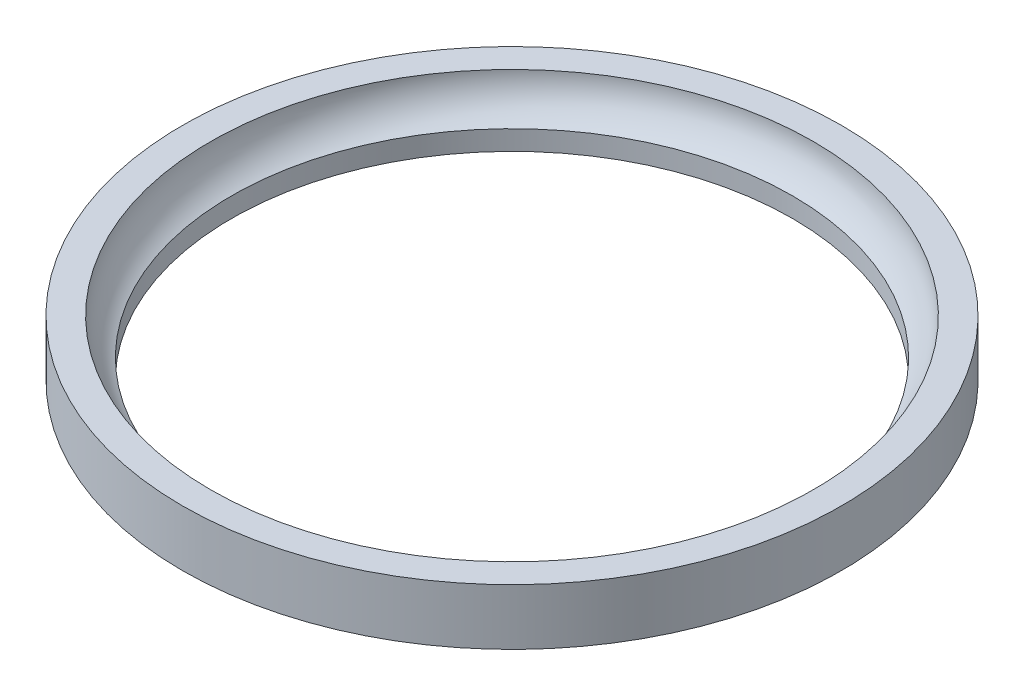
ISO-10303-21;
HEADER;
FILE_DESCRIPTION(('STEP AP214'),'2;1');
FILE_NAME('part.step','',(''),(''),'','','');
FILE_SCHEMA(('AUTOMOTIVE_DESIGN { 1 0 10303 214 1 1 1 1 }'));
ENDSEC;
DATA;
#1=APPLICATION_CONTEXT('core data for automotive mechanical design processes');
#2=APPLICATION_PROTOCOL_DEFINITION('international standard','automotive_design',2000,#1);
#3=PRODUCT_CONTEXT('',#1,'mechanical');
#4=PRODUCT('Part','Part','',(#3));
#5=PRODUCT_RELATED_PRODUCT_CATEGORY('part','',(#4));
#6=PRODUCT_DEFINITION_FORMATION('','',#4);
#7=PRODUCT_DEFINITION_CONTEXT('part definition',#1,'design');
#8=PRODUCT_DEFINITION('design','',#6,#7);
#9=PRODUCT_DEFINITION_SHAPE('','',#8);
#10=(LENGTH_UNIT() NAMED_UNIT(*) SI_UNIT(.MILLI.,.METRE.));
#11=(NAMED_UNIT(*) PLANE_ANGLE_UNIT() SI_UNIT($,.RADIAN.));
#12=(NAMED_UNIT(*) SI_UNIT($,.STERADIAN.) SOLID_ANGLE_UNIT());
#13=UNCERTAINTY_MEASURE_WITH_UNIT(LENGTH_MEASURE(1.E-05),#10,'distance_accuracy_value','');
#14=(GEOMETRIC_REPRESENTATION_CONTEXT(3) GLOBAL_UNCERTAINTY_ASSIGNED_CONTEXT((#13)) GLOBAL_UNIT_ASSIGNED_CONTEXT((#10,
#11,#12)) REPRESENTATION_CONTEXT('',''));
#15=CARTESIAN_POINT('',(0.,0.,0.));
#16=DIRECTION('',(0.,0.,1.));
#17=DIRECTION('',(1.,0.,0.));
#18=AXIS2_PLACEMENT_3D('',#15,#16,#17);
#19=CARTESIAN_POINT('',(0.,1.29903810567666,0.));
#20=DIRECTION('',(0.,-1.,0.));
#21=DIRECTION('',(0.,0.,-1.));
#22=AXIS2_PLACEMENT_3D('',#19,#20,#21);
#23=TOROIDAL_SURFACE('',#22,9.25,1.5);
#24=CARTESIAN_POINT('',(0.,0.,0.));
#25=DIRECTION('',(0.,-1.,0.));
#26=DIRECTION('',(0.,0.,-1.));
#27=AXIS2_PLACEMENT_3D('',#24,#25,#26);
#28=CIRCLE('',#27,10.);
#29=CARTESIAN_POINT('',(0.,0.,-10.));
#30=VERTEX_POINT('',#29);
#31=EDGE_CURVE('E58',#30,#30,#28,.T.);
#32=ORIENTED_EDGE('',*,*,#31,.T.);
#33=EDGE_LOOP('',(#32));
#34=FACE_BOUND('',#33,.T.);
#35=CARTESIAN_POINT('',(0.,1.29903810567666,0.));
#36=DIRECTION('',(0.,-1.,0.));
#37=DIRECTION('',(0.,0.,-1.));
#38=AXIS2_PLACEMENT_3D('',#35,#36,#37);
#39=CIRCLE('',#38,10.75);
#40=CARTESIAN_POINT('',(0.,1.29903810567666,-10.75));
#41=VERTEX_POINT('',#40);
#42=EDGE_CURVE('E10',#41,#41,#39,.T.);
#43=ORIENTED_EDGE('',*,*,#42,.F.);
#44=EDGE_LOOP('',(#43));
#45=FACE_BOUND('',#44,.T.);
#46=ADVANCED_FACE('F39',(#34,#45),#23,.F.);
#47=CARTESIAN_POINT('',(11.75,1.29903810567666,0.));
#48=DIRECTION('',(0.,1.,0.));
#49=DIRECTION('',(0.,0.,1.));
#50=AXIS2_PLACEMENT_3D('',#47,#48,#49);
#51=PLANE('',#50);
#52=ORIENTED_EDGE('',*,*,#42,.T.);
#53=EDGE_LOOP('',(#52));
#54=FACE_BOUND('',#53,.T.);
#55=CARTESIAN_POINT('',(0.,1.29903810567666,0.));
#56=DIRECTION('',(0.,-1.,0.));
#57=DIRECTION('',(0.,0.,-1.));
#58=AXIS2_PLACEMENT_3D('',#55,#56,#57);
#59=CIRCLE('',#58,11.75);
#60=CARTESIAN_POINT('',(0.,1.29903810567666,-11.75));
#61=VERTEX_POINT('',#60);
#62=EDGE_CURVE('E45',#61,#61,#59,.T.);
#63=ORIENTED_EDGE('',*,*,#62,.F.);
#64=EDGE_LOOP('',(#63));
#65=FACE_BOUND('',#64,.T.);
#66=ADVANCED_FACE('F76',(#54,#65),#51,.T.);
#67=CARTESIAN_POINT('',(0.,0.,0.));
#68=DIRECTION('',(0.,-1.,0.));
#69=DIRECTION('',(0.,0.,-1.));
#70=AXIS2_PLACEMENT_3D('',#67,#68,#69);
#71=CYLINDRICAL_SURFACE('',#70,11.75);
#72=ORIENTED_EDGE('',*,*,#62,.T.);
#73=EDGE_LOOP('',(#72));
#74=FACE_BOUND('',#73,.T.);
#75=CARTESIAN_POINT('',(0.,-0.700961894323342,0.));
#76=DIRECTION('',(0.,-1.,0.));
#77=DIRECTION('',(0.,0.,-1.));
#78=AXIS2_PLACEMENT_3D('',#75,#76,#77);
#79=CIRCLE('',#78,11.75);
#80=CARTESIAN_POINT('',(0.,-0.700961894323342,-11.75));
#81=VERTEX_POINT('',#80);
#82=EDGE_CURVE('E49',#81,#81,#79,.T.);
#83=ORIENTED_EDGE('',*,*,#82,.F.);
#84=EDGE_LOOP('',(#83));
#85=FACE_BOUND('',#84,.T.);
#86=ADVANCED_FACE('F72',(#74,#85),#71,.T.);
#87=CARTESIAN_POINT('',(10.,-0.700961894323342,0.));
#88=DIRECTION('',(0.,-1.,0.));
#89=DIRECTION('',(0.,0.,-1.));
#90=AXIS2_PLACEMENT_3D('',#87,#88,#89);
#91=PLANE('',#90);
#92=ORIENTED_EDGE('',*,*,#82,.T.);
#93=EDGE_LOOP('',(#92));
#94=FACE_BOUND('',#93,.T.);
#95=CARTESIAN_POINT('',(0.,-0.700961894323342,0.));
#96=DIRECTION('',(0.,-1.,0.));
#97=DIRECTION('',(0.,0.,-1.));
#98=AXIS2_PLACEMENT_3D('',#95,#96,#97);
#99=CIRCLE('',#98,10.);
#100=CARTESIAN_POINT('',(0.,-0.700961894323342,-10.));
#101=VERTEX_POINT('',#100);
#102=EDGE_CURVE('E53',#101,#101,#99,.T.);
#103=ORIENTED_EDGE('',*,*,#102,.F.);
#104=EDGE_LOOP('',(#103));
#105=FACE_BOUND('',#104,.T.);
#106=ADVANCED_FACE('F66',(#94,#105),#91,.T.);
#107=CARTESIAN_POINT('',(0.,0.,0.));
#108=DIRECTION('',(0.,-1.,0.));
#109=DIRECTION('',(0.,0.,-1.));
#110=AXIS2_PLACEMENT_3D('',#107,#108,#109);
#111=CYLINDRICAL_SURFACE('',#110,10.);
#112=ORIENTED_EDGE('',*,*,#102,.T.);
#113=EDGE_LOOP('',(#112));
#114=FACE_BOUND('',#113,.T.);
#115=ORIENTED_EDGE('',*,*,#31,.F.);
#116=EDGE_LOOP('',(#115));
#117=FACE_BOUND('',#116,.T.);
#118=ADVANCED_FACE('F64',(#114,#117),#111,.F.);
#119=CLOSED_SHELL('',(#46,#66,#86,#106,#118));
#120=MANIFOLD_SOLID_BREP('B2',#119);
#121=ADVANCED_BREP_SHAPE_REPRESENTATION('',(#18,#120),#14);
#122=SHAPE_DEFINITION_REPRESENTATION(#9,#121);
ENDSEC;
END-ISO-10303-21;
